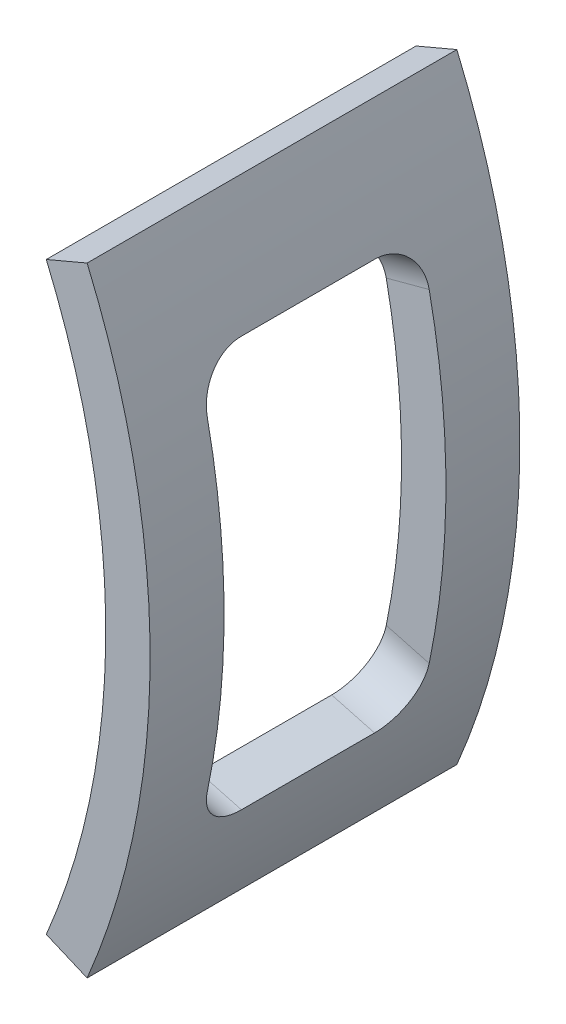
ISO-10303-21;
HEADER;
FILE_DESCRIPTION(('STEP AP214'),'2;1');
FILE_NAME('part.step','',(''),(''),'','','');
FILE_SCHEMA(('AUTOMOTIVE_DESIGN { 1 0 10303 214 1 1 1 1 }'));
ENDSEC;
DATA;
#1=APPLICATION_CONTEXT('core data for automotive mechanical design processes');
#2=APPLICATION_PROTOCOL_DEFINITION('international standard','automotive_design',2000,#1);
#3=PRODUCT_CONTEXT('',#1,'mechanical');
#4=PRODUCT('Part','Part','',(#3));
#5=PRODUCT_RELATED_PRODUCT_CATEGORY('part','',(#4));
#6=PRODUCT_DEFINITION_FORMATION('','',#4);
#7=PRODUCT_DEFINITION_CONTEXT('part definition',#1,'design');
#8=PRODUCT_DEFINITION('design','',#6,#7);
#9=PRODUCT_DEFINITION_SHAPE('','',#8);
#10=(LENGTH_UNIT() NAMED_UNIT(*) SI_UNIT(.MILLI.,.METRE.));
#11=(NAMED_UNIT(*) PLANE_ANGLE_UNIT() SI_UNIT($,.RADIAN.));
#12=(NAMED_UNIT(*) SI_UNIT($,.STERADIAN.) SOLID_ANGLE_UNIT());
#13=UNCERTAINTY_MEASURE_WITH_UNIT(LENGTH_MEASURE(1.E-05),#10,'distance_accuracy_value','');
#14=(GEOMETRIC_REPRESENTATION_CONTEXT(3) GLOBAL_UNCERTAINTY_ASSIGNED_CONTEXT((#13)) GLOBAL_UNIT_ASSIGNED_CONTEXT((#10,
#11,#12)) REPRESENTATION_CONTEXT('',''));
#15=CARTESIAN_POINT('',(0.,0.,0.));
#16=DIRECTION('',(0.,0.,1.));
#17=DIRECTION('',(1.,0.,0.));
#18=AXIS2_PLACEMENT_3D('',#15,#16,#17);
#19=CARTESIAN_POINT('',(0.,0.,17.7187500000009));
#20=DIRECTION('',(0.,0.,1.));
#21=DIRECTION('',(1.,0.,0.));
#22=AXIS2_PLACEMENT_3D('',#19,#20,#21);
#23=CYLINDRICAL_SURFACE('',#22,101.15);
#24=CARTESIAN_POINT('',(0.,0.,25.));
#25=DIRECTION('',(0.,0.,1.));
#26=DIRECTION('',(1.,0.,0.));
#27=AXIS2_PLACEMENT_3D('',#24,#25,#26);
#28=CIRCLE('',#27,101.15);
#29=CARTESIAN_POINT('',(93.1090659267143,-39.5224536466901,25.));
#30=VERTEX_POINT('',#29);
#31=CARTESIAN_POINT('',(93.1090659267143,39.5224536466901,25.));
#32=VERTEX_POINT('',#31);
#33=EDGE_CURVE('E126',#30,#32,#28,.T.);
#34=ORIENTED_EDGE('',*,*,#33,.T.);
#35=DIRECTION('',(0.,0.,1.));
#36=VECTOR('',#35,1.);
#37=CARTESIAN_POINT('',(93.1090659267143,39.5224536466901,25.));
#38=LINE('',#37,#36);
#39=CARTESIAN_POINT('',(93.1090659267143,39.5224536466901,-25.));
#40=VERTEX_POINT('',#39);
#41=EDGE_CURVE('E129',#40,#32,#38,.T.);
#42=ORIENTED_EDGE('',*,*,#41,.F.);
#43=CARTESIAN_POINT('',(0.,0.,-25.));
#44=DIRECTION('',(0.,0.,1.));
#45=DIRECTION('',(1.,0.,0.));
#46=AXIS2_PLACEMENT_3D('',#43,#44,#45);
#47=CIRCLE('',#46,101.15);
#48=CARTESIAN_POINT('',(93.1090659267143,-39.5224536466901,-25.));
#49=VERTEX_POINT('',#48);
#50=EDGE_CURVE('E166',#49,#40,#47,.T.);
#51=ORIENTED_EDGE('',*,*,#50,.F.);
#52=DIRECTION('',(0.,0.,1.));
#53=VECTOR('',#52,1.);
#54=CARTESIAN_POINT('',(93.1090659267143,-39.5224536466901,25.));
#55=LINE('',#54,#53);
#56=EDGE_CURVE('E132',#49,#30,#55,.T.);
#57=ORIENTED_EDGE('',*,*,#56,.T.);
#58=EDGE_LOOP('',(#34,#42,#51,#57));
#59=FACE_BOUND('',#58,.T.);
#60=CARTESIAN_POINT('',(0.,0.,15.));
#61=DIRECTION('',(0.,0.,1.));
#62=DIRECTION('',(1.,0.,0.));
#63=AXIS2_PLACEMENT_3D('',#60,#61,#62);
#64=CIRCLE('',#63,101.15);
#65=CARTESIAN_POINT('',(99.0842702151909,-20.3378931043271,15.));
#66=VERTEX_POINT('',#65);
#67=CARTESIAN_POINT('',(99.0842702151909,20.3378931043271,15.));
#68=VERTEX_POINT('',#67);
#69=EDGE_CURVE('E148',#66,#68,#64,.T.);
#70=ORIENTED_EDGE('',*,*,#69,.F.);
#71=CARTESIAN_POINT('',(99.0842702151909,-20.3378931043271,15.));
#72=CARTESIAN_POINT('',(99.0503488492395,-20.5031758536993,15.0000182217252));
#73=CARTESIAN_POINT('',(99.0160060727869,-20.6683704909268,14.9929085404795));
#74=CARTESIAN_POINT('',(98.9467488016159,-20.9974150237414,14.9645516831957));
#75=CARTESIAN_POINT('',(98.9118343277886,-21.1612649681397,14.9433050226371));
#76=CARTESIAN_POINT('',(98.8417278568613,-21.4863450901174,14.8868131347429));
#77=CARTESIAN_POINT('',(98.8065360810251,-21.6475770932883,14.8515781404965));
#78=CARTESIAN_POINT('',(98.736144584299,-21.9664036417796,14.767355785701));
#79=CARTESIAN_POINT('',(98.7009448635441,-22.123998244824,14.7183686435556));
#80=CARTESIAN_POINT('',(98.6308325335325,-22.4344984681379,14.6069598386645));
#81=CARTESIAN_POINT('',(98.5959200328227,-22.5874023703441,14.5445333190428));
#82=CARTESIAN_POINT('',(98.5267030508532,-22.8874419792117,14.4066690492712));
#83=CARTESIAN_POINT('',(98.4923987984401,-23.0345755390607,14.3312265119255));
#84=CARTESIAN_POINT('',(98.4247584850444,-23.3219037069828,14.1679241140697));
#85=CARTESIAN_POINT('',(98.3914218999316,-23.462102101554,14.0800711328075));
#86=CARTESIAN_POINT('',(98.3260158893124,-23.7347163255531,13.8925062050698));
#87=CARTESIAN_POINT('',(98.2939469083547,-23.8671294324796,13.7927901465206));
#88=CARTESIAN_POINT('',(98.2314508048502,-24.1230576236091,13.5823487362724));
#89=CARTESIAN_POINT('',(98.2010219040371,-24.2465823958109,13.4716356942576));
#90=CARTESIAN_POINT('',(98.1420865783467,-24.4840419740717,13.2398941043679));
#91=CARTESIAN_POINT('',(98.113580154033,-24.5979767773192,13.1188655534689));
#92=CARTESIAN_POINT('',(98.058785355846,-24.8155133876193,12.8673051397891));
#93=CARTESIAN_POINT('',(98.0324978180142,-24.9191113025489,12.7367697291771));
#94=CARTESIAN_POINT('',(97.9824495354845,-25.1151810778407,12.4672102710985));
#95=CARTESIAN_POINT('',(97.9586879198873,-25.2076567744274,12.3281891755607));
#96=CARTESIAN_POINT('',(97.9139246579101,-25.3809747742024,12.042468000183));
#97=CARTESIAN_POINT('',(97.8929256581692,-25.4618059286368,11.8957607422538));
#98=CARTESIAN_POINT('',(97.8539594650688,-25.6111513437929,11.5958888636078));
#99=CARTESIAN_POINT('',(97.8359911747117,-25.6796700617218,11.4427266045454));
#100=CARTESIAN_POINT('',(97.8032877901214,-25.8039440899407,11.1310184795286));
#101=CARTESIAN_POINT('',(97.7885517947013,-25.8597029579561,10.9724741284116));
#102=CARTESIAN_POINT('',(97.7624809114717,-25.9580894260837,10.6511556683923));
#103=CARTESIAN_POINT('',(97.7511452159942,-26.0007201445691,10.488382573934));
#104=CARTESIAN_POINT('',(97.728928551243,-26.0841234337606,10.1068451575689));
#105=CARTESIAN_POINT('',(97.7193615220593,-26.1199070857836,9.88687952484851));
#106=CARTESIAN_POINT('',(97.7097879079764,-26.1556872031681,9.55514280059046));
#107=CARTESIAN_POINT('',(97.7073928637877,-26.1646313419293,9.44432089966399));
#108=CARTESIAN_POINT('',(97.7041975677037,-26.1765601332365,9.22234187261277));
#109=CARTESIAN_POINT('',(97.7033972007916,-26.1795452155826,9.11118477124374));
#110=CARTESIAN_POINT('',(97.7033973291392,-26.17954641212,9.00000000000004));
#111=B_SPLINE_CURVE_WITH_KNOTS('',3,(#71,#72,#73,#74,#75,#76,#77,#78,#79,#80,#81,#82,#83,#84,
#85,#86,#87,#88,#89,#90,#91,#92,#93,#94,#95,#96,#97,#98,#99,#100,#101,#102,#103,#104,#105,#106,
#107,#108,#109,#110),.UNSPECIFIED.,.F.,.F.,(4,2,2,2,2,2,2,2,2,2,2,2,2,2,2,2,2,2,2,4),(0.,
0.506030729008249,1.01204300752844,1.51768579562712,2.0233205538529,2.52913835181936,
3.03514258400317,3.54086742503359,4.04676807797759,4.55210868989614,5.05744944996305,
5.56297977235144,6.06833522643753,6.57417134894587,7.0798239839231,7.5853354596326,
8.09072676672851,8.75834421135759,9.0918244158145,9.42528056696323),.UNSPECIFIED.);
#112=CARTESIAN_POINT('',(97.7033973291392,-26.17954641212,9.00000000000004));
#113=VERTEX_POINT('',#112);
#114=EDGE_CURVE('E217',#66,#113,#111,.T.);
#115=ORIENTED_EDGE('',*,*,#114,.T.);
#116=DIRECTION('',(0.,0.,1.));
#117=VECTOR('',#116,1.);
#118=CARTESIAN_POINT('',(97.7033973291392,-26.17954641212,15.));
#119=LINE('',#118,#117);
#120=CARTESIAN_POINT('',(97.7033973291392,-26.17954641212,-8.99999999999996));
#121=VERTEX_POINT('',#120);
#122=EDGE_CURVE('E276',#121,#113,#119,.T.);
#123=ORIENTED_EDGE('',*,*,#122,.F.);
#124=CARTESIAN_POINT('',(97.7033973291392,-26.17954641212,-8.99999999999996));
#125=CARTESIAN_POINT('',(97.7033895601714,-26.179563114756,-9.16875046089024));
#126=CARTESIAN_POINT('',(97.7052396147699,-26.172670522557,-9.3374983179577));
#127=CARTESIAN_POINT('',(97.7125992452598,-26.1451873781737,-9.673786789175));
#128=CARTESIAN_POINT('',(97.7181086461544,-26.12459748102,-9.84132746066742));
#129=CARTESIAN_POINT('',(97.73272537506,-26.0698608501464,-10.1738912487409));
#130=CARTESIAN_POINT('',(97.7418300040048,-26.0357242862985,-10.338916157689));
#131=CARTESIAN_POINT('',(97.7635278221914,-25.9541310824166,-10.6654029993976));
#132=CARTESIAN_POINT('',(97.7761209688387,-25.9066746050179,-10.8268649756353));
#133=CARTESIAN_POINT('',(97.8046540419408,-25.7987452867056,-11.1451294508987));
#134=CARTESIAN_POINT('',(97.8205949887383,-25.738268477313,-11.3019305127003));
#135=CARTESIAN_POINT('',(97.855643299667,-25.6046937405142,-11.609763768627));
#136=CARTESIAN_POINT('',(97.8747518280464,-25.5315911720809,-11.7607938164005));
#137=CARTESIAN_POINT('',(97.9159015534227,-25.3733206583454,-12.0558704863326));
#138=CARTESIAN_POINT('',(97.937941181334,-25.2881591668969,-12.1999207890098));
#139=CARTESIAN_POINT('',(97.984720534947,-25.1062911824136,-12.4801486811041));
#140=CARTESIAN_POINT('',(98.0094611962612,-25.0095806878173,-12.6163235173882));
#141=CARTESIAN_POINT('',(98.0613530281361,-24.8053348434355,-12.8797335163064));
#142=CARTESIAN_POINT('',(98.0885034004354,-24.6978030768281,-13.0069716145645));
#143=CARTESIAN_POINT('',(98.1449258990062,-24.4726273197551,-13.2516524009325));
#144=CARTESIAN_POINT('',(98.1741980241742,-24.3549833345482,-13.3690950941364));
#145=CARTESIAN_POINT('',(98.2345628144603,-24.1103513474988,-13.593389781772));
#146=CARTESIAN_POINT('',(98.2656561238266,-23.9833600348892,-13.700237991945));
#147=CARTESIAN_POINT('',(98.3293192121123,-23.7209969219757,-13.90250095528));
#148=CARTESIAN_POINT('',(98.3618884737456,-23.5856280518166,-13.9979196721401));
#149=CARTESIAN_POINT('',(98.4281821620848,-23.3074215306713,-14.1766832585618));
#150=CARTESIAN_POINT('',(98.4619065058701,-23.1645844154273,-14.260028992578));
#151=CARTESIAN_POINT('',(98.5301698766885,-22.8724858920125,-14.414036745076));
#152=CARTESIAN_POINT('',(98.5647086029673,-22.7232268391975,-14.4847033654964));
#153=CARTESIAN_POINT('',(98.6342797320511,-22.419314072732,-14.612876564007));
#154=CARTESIAN_POINT('',(98.6693120024614,-22.2646617900052,-14.6703866026251));
#155=CARTESIAN_POINT('',(98.7395486153922,-21.9510791802595,-14.771854501939));
#156=CARTESIAN_POINT('',(98.7747529150235,-21.7921498790577,-14.8158155813223));
#157=CARTESIAN_POINT('',(98.8562982064023,-21.4196579702241,-14.901751967831));
#158=CARTESIAN_POINT('',(98.9026021445271,-21.2048700210604,-14.9386011249172));
#159=CARTESIAN_POINT('',(98.9713580517938,-20.8807332464112,-14.9754405445462));
#160=CARTESIAN_POINT('',(98.9941486358303,-20.7724172928169,-14.9846479605663));
#161=CARTESIAN_POINT('',(99.0394410263247,-20.5553864901146,-14.9969268982933));
#162=CARTESIAN_POINT('',(99.0619428545109,-20.4466716718215,-14.9999988844013));
#163=CARTESIAN_POINT('',(99.0842702151909,-20.3378931043271,-15.));
#164=B_SPLINE_CURVE_WITH_KNOTS('',3,(#124,#125,#126,#127,#128,#129,#130,#131,#132,#133,#134,
#135,#136,#137,#138,#139,#140,#141,#142,#143,#144,#145,#146,#147,#148,#149,#150,#151,#152,#153,
#154,#155,#156,#157,#158,#159,#160,#161,#162,#163),.UNSPECIFIED.,.F.,.F.,(4,2,2,2,2,2,2,2,2,2,2,
2,2,2,2,2,2,2,2,4),(0.,0.506096873633892,1.01216954651409,1.51786301265747,2.02355030458321,
2.52939194416333,3.03541992032662,3.54117809022811,4.04711200920935,4.55287894936079,
5.0586456264963,5.56459231324857,6.07036302877287,6.57609751197279,7.08164806370763,
7.58706548903622,8.09236275480783,8.75917199928035,9.09223884516293,9.42528047969037),.UNSPECIFIED.);
#165=CARTESIAN_POINT('',(99.0842702151909,-20.3378931043271,-15.));
#166=VERTEX_POINT('',#165);
#167=EDGE_CURVE('E189',#121,#166,#164,.T.);
#168=ORIENTED_EDGE('',*,*,#167,.T.);
#169=CARTESIAN_POINT('',(0.,0.,-15.));
#170=DIRECTION('',(0.,0.,1.));
#171=DIRECTION('',(1.,0.,0.));
#172=AXIS2_PLACEMENT_3D('',#169,#170,#171);
#173=CIRCLE('',#172,101.15);
#174=CARTESIAN_POINT('',(99.0842702151909,20.3378931043271,-15.));
#175=VERTEX_POINT('',#174);
#176=EDGE_CURVE('E267',#166,#175,#173,.T.);
#177=ORIENTED_EDGE('',*,*,#176,.T.);
#178=CARTESIAN_POINT('',(99.0842702151909,20.3378931043271,-15.));
#179=CARTESIAN_POINT('',(99.0503488492395,20.5031758536993,-15.0000182217251));
#180=CARTESIAN_POINT('',(99.0160060727869,20.6683704909268,-14.9929085404794));
#181=CARTESIAN_POINT('',(98.9467488016159,20.9974150237414,-14.9645516831956));
#182=CARTESIAN_POINT('',(98.9118343277886,21.1612649681397,-14.943305022637));
#183=CARTESIAN_POINT('',(98.8417278568613,21.4863450901174,-14.8868131347428));
#184=CARTESIAN_POINT('',(98.8065360810251,21.6475770932883,-14.8515781404964));
#185=CARTESIAN_POINT('',(98.736144584299,21.9664036417796,-14.7673557857009));
#186=CARTESIAN_POINT('',(98.7009448635441,22.1239982448241,-14.7183686435556));
#187=CARTESIAN_POINT('',(98.6308325335325,22.4344984681379,-14.6069598386644));
#188=CARTESIAN_POINT('',(98.5959200328227,22.5874023703441,-14.5445333190427));
#189=CARTESIAN_POINT('',(98.5267030508532,22.8874419792117,-14.4066690492711));
#190=CARTESIAN_POINT('',(98.4923987984401,23.0345755390607,-14.3312265119254));
#191=CARTESIAN_POINT('',(98.4247584850444,23.3219037069828,-14.1679241140697));
#192=CARTESIAN_POINT('',(98.3914218999316,23.462102101554,-14.0800711328075));
#193=CARTESIAN_POINT('',(98.3260158893124,23.7347163255531,-13.8925062050697));
#194=CARTESIAN_POINT('',(98.2939469083547,23.8671294324796,-13.7927901465206));
#195=CARTESIAN_POINT('',(98.2314508048502,24.1230576236091,-13.5823487362723));
#196=CARTESIAN_POINT('',(98.2010219040371,24.2465823958109,-13.4716356942575));
#197=CARTESIAN_POINT('',(98.1420865783467,24.4840419740717,-13.2398941043679));
#198=CARTESIAN_POINT('',(98.113580154033,24.5979767773192,-13.1188655534688));
#199=CARTESIAN_POINT('',(98.058785355846,24.8155133876193,-12.867305139789));
#200=CARTESIAN_POINT('',(98.0324978180142,24.9191113025489,-12.736769729177));
#201=CARTESIAN_POINT('',(97.9824495354845,25.1151810778407,-12.4672102710984));
#202=CARTESIAN_POINT('',(97.9586879198873,25.2076567744274,-12.3281891755606));
#203=CARTESIAN_POINT('',(97.9139246579101,25.3809747742024,-12.0424680001829));
#204=CARTESIAN_POINT('',(97.8929256581692,25.4618059286368,-11.8957607422538));
#205=CARTESIAN_POINT('',(97.8539594650688,25.6111513437929,-11.5958888636077));
#206=CARTESIAN_POINT('',(97.8359911747117,25.6796700617218,-11.4427266045453));
#207=CARTESIAN_POINT('',(97.8032877901214,25.8039440899407,-11.1310184795285));
#208=CARTESIAN_POINT('',(97.7885517947013,25.8597029579561,-10.9724741284115));
#209=CARTESIAN_POINT('',(97.7624809114717,25.9580894260837,-10.6511556683922));
#210=CARTESIAN_POINT('',(97.7511452159942,26.0007201445691,-10.4883825739339));
#211=CARTESIAN_POINT('',(97.728928551243,26.0841234337606,-10.1068451575688));
#212=CARTESIAN_POINT('',(97.7193615220593,26.1199070857836,-9.88687952484843));
#213=CARTESIAN_POINT('',(97.7097879079764,26.1556872031681,-9.55514280059038));
#214=CARTESIAN_POINT('',(97.7073928637877,26.1646313419293,-9.44432089966391));
#215=CARTESIAN_POINT('',(97.7041975677037,26.1765601332365,-9.2223418726127));
#216=CARTESIAN_POINT('',(97.7033972007916,26.1795452155826,-9.11118477124367));
#217=CARTESIAN_POINT('',(97.7033973291392,26.17954641212,-8.99999999999996));
#218=B_SPLINE_CURVE_WITH_KNOTS('',3,(#178,#179,#180,#181,#182,#183,#184,#185,#186,#187,#188,
#189,#190,#191,#192,#193,#194,#195,#196,#197,#198,#199,#200,#201,#202,#203,#204,#205,#206,#207,
#208,#209,#210,#211,#212,#213,#214,#215,#216,#217),.UNSPECIFIED.,.F.,.F.,(4,2,2,2,2,2,2,2,2,2,2,
2,2,2,2,2,2,2,2,4),(0.,0.50603072900825,1.01204300752844,1.51768579562712,2.0233205538529,
2.52913835181936,3.03514258400317,3.54086742503359,4.04676807797759,4.55210868989614,
5.05744944996306,5.56297977235145,6.06833522643754,6.57417134894587,7.0798239839231,
7.58533545963261,8.09072676672852,8.75834421135759,9.09182441581451,9.42528056696323),.UNSPECIFIED.);
#219=CARTESIAN_POINT('',(97.7033973291392,26.17954641212,-8.99999999999996));
#220=VERTEX_POINT('',#219);
#221=EDGE_CURVE('E222',#175,#220,#218,.T.);
#222=ORIENTED_EDGE('',*,*,#221,.T.);
#223=DIRECTION('',(0.,0.,1.));
#224=VECTOR('',#223,1.);
#225=CARTESIAN_POINT('',(97.7033973291392,26.17954641212,15.));
#226=LINE('',#225,#224);
#227=CARTESIAN_POINT('',(97.7033973291392,26.17954641212,9.00000000000004));
#228=VERTEX_POINT('',#227);
#229=EDGE_CURVE('E271',#220,#228,#226,.T.);
#230=ORIENTED_EDGE('',*,*,#229,.T.);
#231=CARTESIAN_POINT('',(97.7033973291392,26.17954641212,9.00000000000004));
#232=CARTESIAN_POINT('',(97.7033895601714,26.179563114756,9.16875046089031));
#233=CARTESIAN_POINT('',(97.7052396147699,26.172670522557,9.33749831795778));
#234=CARTESIAN_POINT('',(97.7125992452598,26.1451873781737,9.67378678917507));
#235=CARTESIAN_POINT('',(97.7181086461545,26.12459748102,9.84132746066749));
#236=CARTESIAN_POINT('',(97.7327253750601,26.0698608501464,10.1738912487409));
#237=CARTESIAN_POINT('',(97.7418300040048,26.0357242862985,10.3389161576891));
#238=CARTESIAN_POINT('',(97.7635278221914,25.9541310824166,10.6654029993977));
#239=CARTESIAN_POINT('',(97.7761209688387,25.9066746050179,10.8268649756354));
#240=CARTESIAN_POINT('',(97.8046540419408,25.7987452867056,11.1451294508988));
#241=CARTESIAN_POINT('',(97.8205949887383,25.738268477313,11.3019305127004));
#242=CARTESIAN_POINT('',(97.855643299667,25.6046937405142,11.6097637686271));
#243=CARTESIAN_POINT('',(97.8747518280464,25.5315911720809,11.7607938164006));
#244=CARTESIAN_POINT('',(97.9159015534227,25.3733206583454,12.0558704863327));
#245=CARTESIAN_POINT('',(97.937941181334,25.2881591668969,12.1999207890099));
#246=CARTESIAN_POINT('',(97.984720534947,25.1062911824136,12.4801486811042));
#247=CARTESIAN_POINT('',(98.0094611962612,25.0095806878173,12.6163235173882));
#248=CARTESIAN_POINT('',(98.0613530281361,24.8053348434355,12.8797335163065));
#249=CARTESIAN_POINT('',(98.0885034004354,24.6978030768281,13.0069716145646));
#250=CARTESIAN_POINT('',(98.1449258990062,24.4726273197551,13.2516524009326));
#251=CARTESIAN_POINT('',(98.1741980241742,24.3549833345482,13.3690950941365));
#252=CARTESIAN_POINT('',(98.2345628144603,24.1103513474988,13.593389781772));
#253=CARTESIAN_POINT('',(98.2656561238267,23.9833600348892,13.7002379919451));
#254=CARTESIAN_POINT('',(98.3293192121123,23.7209969219757,13.9025009552801));
#255=CARTESIAN_POINT('',(98.3618884737456,23.5856280518166,13.9979196721402));
#256=CARTESIAN_POINT('',(98.4281821620848,23.3074215306713,14.1766832585619));
#257=CARTESIAN_POINT('',(98.4619065058701,23.1645844154273,14.2600289925781));
#258=CARTESIAN_POINT('',(98.5301698766886,22.8724858920125,14.4140367450761));
#259=CARTESIAN_POINT('',(98.5647086029673,22.7232268391975,14.4847033654965));
#260=CARTESIAN_POINT('',(98.6342797320511,22.419314072732,14.612876564007));
#261=CARTESIAN_POINT('',(98.6693120024614,22.2646617900052,14.6703866026252));
#262=CARTESIAN_POINT('',(98.7395486153922,21.9510791802595,14.7718545019391));
#263=CARTESIAN_POINT('',(98.7747529150236,21.7921498790577,14.8158155813224));
#264=CARTESIAN_POINT('',(98.8562982064023,21.4196579702241,14.9017519678311));
#265=CARTESIAN_POINT('',(98.9026021445271,21.2048700210604,14.9386011249172));
#266=CARTESIAN_POINT('',(98.9713580517938,20.8807332464112,14.9754405445463));
#267=CARTESIAN_POINT('',(98.9941486358303,20.7724172928169,14.9846479605664));
#268=CARTESIAN_POINT('',(99.0394410263247,20.5553864901146,14.9969268982934));
#269=CARTESIAN_POINT('',(99.0619428545109,20.4466716718215,14.9999988844014));
#270=CARTESIAN_POINT('',(99.0842702151909,20.3378931043271,15.));
#271=B_SPLINE_CURVE_WITH_KNOTS('',3,(#231,#232,#233,#234,#235,#236,#237,#238,#239,#240,#241,
#242,#243,#244,#245,#246,#247,#248,#249,#250,#251,#252,#253,#254,#255,#256,#257,#258,#259,#260,
#261,#262,#263,#264,#265,#266,#267,#268,#269,#270),.UNSPECIFIED.,.F.,.F.,(4,2,2,2,2,2,2,2,2,2,2,
2,2,2,2,2,2,2,2,4),(0.,0.506096873633892,1.01216954651409,1.51786301265747,2.02355030458321,
2.52939194416332,3.03541992032662,3.54117809022811,4.04711200920935,4.5528789493608,
5.05864562649631,5.56459231324858,6.07036302877288,6.5760975119728,7.08164806370764,
7.58706548903623,8.09236275480784,8.75917199928035,9.09223884516293,9.42528047969037),.UNSPECIFIED.);
#272=EDGE_CURVE('E11',#228,#68,#271,.T.);
#273=ORIENTED_EDGE('',*,*,#272,.T.);
#274=EDGE_LOOP('',(#70,#115,#123,#168,#177,#222,#230,#273));
#275=FACE_BOUND('',#274,.T.);
#276=ADVANCED_FACE('F33',(#59,#275),#23,.F.);
#277=CARTESIAN_POINT('',(0.,0.,17.7187500000009));
#278=DIRECTION('',(0.,0.,1.));
#279=DIRECTION('',(1.,0.,0.));
#280=AXIS2_PLACEMENT_3D('',#277,#278,#279);
#281=CYLINDRICAL_SURFACE('',#280,107.15);
#282=CARTESIAN_POINT('',(0.,0.,-25.));
#283=DIRECTION('',(0.,0.,1.));
#284=DIRECTION('',(1.,0.,0.));
#285=AXIS2_PLACEMENT_3D('',#282,#283,#284);
#286=CIRCLE('',#285,107.15);
#287=CARTESIAN_POINT('',(98.6320950474289,-41.8668404176258,-25.));
#288=VERTEX_POINT('',#287);
#289=CARTESIAN_POINT('',(98.6320950474289,41.8668404176258,-25.));
#290=VERTEX_POINT('',#289);
#291=EDGE_CURVE('E168',#288,#290,#286,.T.);
#292=ORIENTED_EDGE('',*,*,#291,.T.);
#293=DIRECTION('',(0.,0.,-1.));
#294=VECTOR('',#293,1.);
#295=CARTESIAN_POINT('',(98.6320950474289,41.8668404176258,25.));
#296=LINE('',#295,#294);
#297=CARTESIAN_POINT('',(98.6320950474289,41.8668404176258,25.));
#298=VERTEX_POINT('',#297);
#299=EDGE_CURVE('E151',#298,#290,#296,.T.);
#300=ORIENTED_EDGE('',*,*,#299,.F.);
#301=CARTESIAN_POINT('',(0.,0.,25.));
#302=DIRECTION('',(0.,0.,1.));
#303=DIRECTION('',(1.,0.,0.));
#304=AXIS2_PLACEMENT_3D('',#301,#302,#303);
#305=CIRCLE('',#304,107.15);
#306=CARTESIAN_POINT('',(98.6320950474289,-41.8668404176258,25.));
#307=VERTEX_POINT('',#306);
#308=EDGE_CURVE('E138',#307,#298,#305,.T.);
#309=ORIENTED_EDGE('',*,*,#308,.F.);
#310=DIRECTION('',(0.,0.,-1.));
#311=VECTOR('',#310,1.);
#312=CARTESIAN_POINT('',(98.6320950474289,-41.8668404176258,25.));
#313=LINE('',#312,#311);
#314=EDGE_CURVE('E160',#307,#288,#313,.T.);
#315=ORIENTED_EDGE('',*,*,#314,.T.);
#316=EDGE_LOOP('',(#292,#300,#309,#315));
#317=FACE_BOUND('',#316,.T.);
#318=CARTESIAN_POINT('',(0.,0.,-15.));
#319=DIRECTION('',(0.,0.,1.));
#320=DIRECTION('',(1.,0.,0.));
#321=AXIS2_PLACEMENT_3D('',#318,#319,#320);
#322=CIRCLE('',#321,107.15);
#323=CARTESIAN_POINT('',(104.889474437927,-21.8933928877069,-15.));
#324=VERTEX_POINT('',#323);
#325=CARTESIAN_POINT('',(104.889474437927,21.8933928877069,-15.));
#326=VERTEX_POINT('',#325);
#327=EDGE_CURVE('E257',#324,#326,#322,.T.);
#328=ORIENTED_EDGE('',*,*,#327,.F.);
#329=CARTESIAN_POINT('',(104.889474437927,-21.8933928877069,-15.));
#330=CARTESIAN_POINT('',(104.855002479608,-22.0585648590071,-15.0000182137029));
#331=CARTESIAN_POINT('',(104.82013301044,-22.22365213008,-14.9929055530653));
#332=CARTESIAN_POINT('',(104.749872443648,-22.5524889943068,-14.964538180414));
#333=CARTESIAN_POINT('',(104.714481365745,-22.7162386376712,-14.9432840017204));
#334=CARTESIAN_POINT('',(104.643474365405,-23.0411254961041,-14.8867739906038));
#335=CARTESIAN_POINT('',(104.607858626779,-23.2022645379716,-14.8515284320432));
#336=CARTESIAN_POINT('',(104.536671877529,-23.5209134375623,-14.7672830388519));
#337=CARTESIAN_POINT('',(104.501100866221,-23.6784233514323,-14.718283417167));
#338=CARTESIAN_POINT('',(104.430298069764,-23.9887617832138,-14.6068490838759));
#339=CARTESIAN_POINT('',(104.395066409743,-24.141588616491,-14.5444096009122));
#340=CARTESIAN_POINT('',(104.325261188575,-24.4414829955004,-14.4065193813338));
#341=CARTESIAN_POINT('',(104.290687874757,-24.5885483978714,-14.3310638578642));
#342=CARTESIAN_POINT('',(104.222556859952,-24.8757495441563,-14.1677358067531));
#343=CARTESIAN_POINT('',(104.188998610644,-25.0158890562208,-14.0798701337381));
#344=CARTESIAN_POINT('',(104.123192793141,-25.2883941864514,-13.8922805373558));
#345=CARTESIAN_POINT('',(104.090945684647,-25.4207570851575,-13.7925525021947));
#346=CARTESIAN_POINT('',(104.02812958397,-25.6766059519369,-13.5820774233368));
#347=CARTESIAN_POINT('',(103.997558935247,-25.8001007215228,-13.4713415725661));
#348=CARTESIAN_POINT('',(103.93837486166,-26.0375056662336,-13.2395532706604));
#349=CARTESIAN_POINT('',(103.909761437329,-26.1514158387427,-13.1185008167097));
#350=CARTESIAN_POINT('',(103.854782356941,-26.3689072941262,-12.8668918265981));
#351=CARTESIAN_POINT('',(103.828417546687,-26.4724846928454,-12.7363317481268));
#352=CARTESIAN_POINT('',(103.7782394039,-26.6685163308698,-12.4667224199963));
#353=CARTESIAN_POINT('',(103.754425191657,-26.7609744066179,-12.3276761233987));
#354=CARTESIAN_POINT('',(103.709577328443,-26.9342549750837,-12.0419104626401));
#355=CARTESIAN_POINT('',(103.688546221446,-27.015066828175,-11.8951842470482));
#356=CARTESIAN_POINT('',(103.649530548157,-27.1643750431081,-11.595275079888));
#357=CARTESIAN_POINT('',(103.631544879272,-27.2328758626861,-11.4420944903035));
#358=CARTESIAN_POINT('',(103.598817197574,-27.357114369006,-11.1303506825108));
#359=CARTESIAN_POINT('',(103.584074278312,-27.412855622617,-10.9717889828301));
#360=CARTESIAN_POINT('',(103.557996348639,-27.5112062845778,-10.6504369443283));
#361=CARTESIAN_POINT('',(103.546660527865,-27.5538188155961,-10.4876476210516));
#362=CARTESIAN_POINT('',(103.524456117079,-27.6371480268526,-10.1062133489252));
#363=CARTESIAN_POINT('',(103.514898952397,-27.6728902682508,-9.88637125964762));
#364=CARTESIAN_POINT('',(103.505335629367,-27.7086290179528,-9.5548232540336));
#365=CARTESIAN_POINT('',(103.502943264385,-27.7175628254832,-9.44406491636855));
#366=CARTESIAN_POINT('',(103.499751597834,-27.7294778510422,-9.22221357403327));
#367=CARTESIAN_POINT('',(103.498952181816,-27.7324594967183,-9.11112059398066));
#368=CARTESIAN_POINT('',(103.498952286874,-27.7324606827352,-8.99999999999996));
#369=B_SPLINE_CURVE_WITH_KNOTS('',3,(#329,#330,#331,#332,#333,#334,#335,#336,#337,#338,#339,
#340,#341,#342,#343,#344,#345,#346,#347,#348,#349,#350,#351,#352,#353,#354,#355,#356,#357,#358,
#359,#360,#361,#362,#363,#364,#365,#366,#367,#368),.UNSPECIFIED.,.F.,.F.,(4,2,2,2,2,2,2,2,2,2,2,
2,2,2,2,2,2,2,2,4),(0.,0.506039836383025,1.01206058953206,1.5177104572133,2.02335249665725,
2.52917434375126,3.03518261299021,3.54091247855246,4.04681815649895,4.55221458332827,
5.05761114810238,5.56319698438721,6.06860787746924,6.57447761036916,7.08016380082348,
7.58570845627877,8.09113277487715,8.75836639019175,9.09165414214253,9.42491794735142),.UNSPECIFIED.);
#370=CARTESIAN_POINT('',(103.498952286874,-27.7324606827352,-8.99999999999996));
#371=VERTEX_POINT('',#370);
#372=EDGE_CURVE('E195',#324,#371,#369,.T.);
#373=ORIENTED_EDGE('',*,*,#372,.T.);
#374=DIRECTION('',(0.,0.,-1.));
#375=VECTOR('',#374,1.);
#376=CARTESIAN_POINT('',(103.498952286874,-27.7324606827352,15.));
#377=LINE('',#376,#375);
#378=CARTESIAN_POINT('',(103.498952286874,-27.7324606827352,9.00000000000004));
#379=VERTEX_POINT('',#378);
#380=EDGE_CURVE('E281',#379,#371,#377,.T.);
#381=ORIENTED_EDGE('',*,*,#380,.F.);
#382=CARTESIAN_POINT('',(103.498952286874,-27.7324606827352,9.00000000000004));
#383=CARTESIAN_POINT('',(103.498944689861,-27.7324774317312,9.16875109997214));
#384=CARTESIAN_POINT('',(103.500794591859,-27.7255847425498,9.3374995960307));
#385=CARTESIAN_POINT('',(103.508154510752,-27.6981014527797,9.67378932891547));
#386=CARTESIAN_POINT('',(103.513664352564,-27.6775115074404,9.84133062310428));
#387=CARTESIAN_POINT('',(103.528283793581,-27.6227751818823,10.1738955197705));
#388=CARTESIAN_POINT('',(103.537390689973,-27.5886389801775,10.338920916209));
#389=CARTESIAN_POINT('',(103.559097271754,-27.5070475472355,10.6654087014351));
#390=CARTESIAN_POINT('',(103.571696914498,-27.4595924786171,10.8268711336993));
#391=CARTESIAN_POINT('',(103.60025036058,-27.3516678813587,11.1451364536167));
#392=CARTESIAN_POINT('',(103.61620518576,-27.291194387747,11.3019379050977));
#393=CARTESIAN_POINT('',(103.651292528599,-27.157629210476,11.6097719264582));
#394=CARTESIAN_POINT('',(103.670426214645,-27.0845328869194,11.7608023500052));
#395=CARTESIAN_POINT('',(103.711641970296,-26.9262789505492,12.0558797811626));
#396=CARTESIAN_POINT('',(103.733722462103,-26.8411277907401,12.1999304700348));
#397=CARTESIAN_POINT('',(103.780604148555,-26.6592857714626,12.4801592303015));
#398=CARTESIAN_POINT('',(103.805406286003,-26.5625909121194,12.616334548489));
#399=CARTESIAN_POINT('',(103.857447180112,-26.3583812096631,12.8797477974668));
#400=CARTESIAN_POINT('',(103.884685168983,-26.2508697746442,13.0069885220537));
#401=CARTESIAN_POINT('',(103.941313838111,-26.02574198155,13.2516745247864));
#402=CARTESIAN_POINT('',(103.970704517395,-25.9081256280409,13.3691198073586));
#403=CARTESIAN_POINT('',(104.031342462046,-25.6635570318604,13.5934198336874));
#404=CARTESIAN_POINT('',(104.062590387176,-25.5366014676975,13.7002707775354));
#405=CARTESIAN_POINT('',(104.126603314154,-25.2743188742587,13.902539153693));
#406=CARTESIAN_POINT('',(104.15936778472,-25.1389947711742,13.9979605486304));
#407=CARTESIAN_POINT('',(104.226098919925,-24.8608778915386,14.1767353548146));
#408=CARTESIAN_POINT('',(104.260065579899,-24.7180851439568,14.2600888128658));
#409=CARTESIAN_POINT('',(104.328861764362,-24.4260842902149,14.4141097598332));
#410=CARTESIAN_POINT('',(104.363690970557,-24.2768785360304,14.484781851265));
#411=CARTESIAN_POINT('',(104.433893598845,-23.9730818610813,14.6129629850137));
#412=CARTESIAN_POINT('',(104.469266873837,-23.8184923821046,14.6704755207621));
#413=CARTESIAN_POINT('',(104.540237357405,-23.5050444785217,14.771944810315));
#414=CARTESIAN_POINT('',(104.575834510666,-23.3461870789256,14.8159047878991));
#415=CARTESIAN_POINT('',(104.658327118875,-22.9739845618462,14.9018074305662));
#416=CARTESIAN_POINT('',(104.705205020529,-22.7594205153728,14.9386349804929));
#417=CARTESIAN_POINT('',(104.774888014302,-22.4356316214572,14.9754536062257));
#418=CARTESIAN_POINT('',(104.797998482894,-22.3274335160231,14.9846560266949));
#419=CARTESIAN_POINT('',(104.843952113126,-22.1106419406784,14.996928437449));
#420=CARTESIAN_POINT('',(104.866795294691,-22.0020485010393,14.9999988877715));
#421=CARTESIAN_POINT('',(104.889474437927,-21.8933928877069,15.));
#422=B_SPLINE_CURVE_WITH_KNOTS('',3,(#382,#383,#384,#385,#386,#387,#388,#389,#390,#391,#392,
#393,#394,#395,#396,#397,#398,#399,#400,#401,#402,#403,#404,#405,#406,#407,#408,#409,#410,#411,
#412,#413,#414,#415,#416,#417,#418,#419,#420,#421),.UNSPECIFIED.,.F.,.F.,(4,2,2,2,2,2,2,2,2,2,2,
2,2,2,2,2,2,2,2,4),(0.,0.506098789026901,1.01217336903637,1.51786840778819,2.02355727244937,
2.52940037127593,3.03542980513655,3.54118937643204,4.04712470409316,4.55290111757548,
5.05867730250593,5.56463424466085,6.07041526053115,6.57619431471863,7.08178943090887,
7.5872501720137,8.09259058502308,8.7591040147883,9.09202343004855,9.42491786781305),.UNSPECIFIED.);
#423=CARTESIAN_POINT('',(104.889474437927,-21.8933928877069,15.));
#424=VERTEX_POINT('',#423);
#425=EDGE_CURVE('E241',#379,#424,#422,.T.);
#426=ORIENTED_EDGE('',*,*,#425,.T.);
#427=CARTESIAN_POINT('',(0.,0.,15.));
#428=DIRECTION('',(0.,0.,1.));
#429=DIRECTION('',(1.,0.,0.));
#430=AXIS2_PLACEMENT_3D('',#427,#428,#429);
#431=CIRCLE('',#430,107.15);
#432=CARTESIAN_POINT('',(104.889474437927,21.8933928877069,15.));
#433=VERTEX_POINT('',#432);
#434=EDGE_CURVE('E266',#424,#433,#431,.T.);
#435=ORIENTED_EDGE('',*,*,#434,.T.);
#436=CARTESIAN_POINT('',(104.889474437927,21.8933928877069,15.));
#437=CARTESIAN_POINT('',(104.855002479608,22.0585648590071,15.000018213703));
#438=CARTESIAN_POINT('',(104.82013301044,22.22365213008,14.9929055530653));
#439=CARTESIAN_POINT('',(104.749872443648,22.5524889943068,14.964538180414));
#440=CARTESIAN_POINT('',(104.714481365745,22.7162386376712,14.9432840017204));
#441=CARTESIAN_POINT('',(104.643474365405,23.0411254961041,14.8867739906038));
#442=CARTESIAN_POINT('',(104.607858626779,23.2022645379716,14.8515284320433));
#443=CARTESIAN_POINT('',(104.536671877529,23.5209134375623,14.767283038852));
#444=CARTESIAN_POINT('',(104.501100866221,23.6784233514323,14.7182834171671));
#445=CARTESIAN_POINT('',(104.430298069764,23.9887617832138,14.606849083876));
#446=CARTESIAN_POINT('',(104.395066409743,24.141588616491,14.5444096009123));
#447=CARTESIAN_POINT('',(104.325261188575,24.4414829955004,14.4065193813339));
#448=CARTESIAN_POINT('',(104.290687874757,24.5885483978714,14.3310638578643));
#449=CARTESIAN_POINT('',(104.222556859952,24.8757495441563,14.1677358067532));
#450=CARTESIAN_POINT('',(104.188998610644,25.0158890562208,14.0798701337382));
#451=CARTESIAN_POINT('',(104.123192793141,25.2883941864514,13.8922805373559));
#452=CARTESIAN_POINT('',(104.090945684647,25.4207570851575,13.7925525021948));
#453=CARTESIAN_POINT('',(104.02812958397,25.6766059519369,13.5820774233369));
#454=CARTESIAN_POINT('',(103.997558935247,25.8001007215228,13.4713415725661));
#455=CARTESIAN_POINT('',(103.93837486166,26.0375056662336,13.2395532706605));
#456=CARTESIAN_POINT('',(103.909761437329,26.1514158387427,13.1185008167098));
#457=CARTESIAN_POINT('',(103.854782356941,26.3689072941262,12.8668918265982));
#458=CARTESIAN_POINT('',(103.828417546687,26.4724846928454,12.7363317481269));
#459=CARTESIAN_POINT('',(103.7782394039,26.6685163308698,12.4667224199964));
#460=CARTESIAN_POINT('',(103.754425191657,26.7609744066179,12.3276761233988));
#461=CARTESIAN_POINT('',(103.709577328443,26.9342549750837,12.0419104626402));
#462=CARTESIAN_POINT('',(103.688546221446,27.015066828175,11.8951842470483));
#463=CARTESIAN_POINT('',(103.649530548157,27.1643750431081,11.595275079888));
#464=CARTESIAN_POINT('',(103.631544879272,27.2328758626861,11.4420944903036));
#465=CARTESIAN_POINT('',(103.598817197574,27.357114369006,11.1303506825109));
#466=CARTESIAN_POINT('',(103.584074278312,27.412855622617,10.9717889828302));
#467=CARTESIAN_POINT('',(103.557996348639,27.5112062845778,10.6504369443284));
#468=CARTESIAN_POINT('',(103.546660527865,27.5538188155961,10.4876476210517));
#469=CARTESIAN_POINT('',(103.524456117079,27.6371480268526,10.1062133489252));
#470=CARTESIAN_POINT('',(103.514898952397,27.6728902682508,9.88637125964769));
#471=CARTESIAN_POINT('',(103.505335629367,27.7086290179527,9.55482325403368));
#472=CARTESIAN_POINT('',(103.502943264385,27.7175628254832,9.44406491636863));
#473=CARTESIAN_POINT('',(103.499751597834,27.7294778510422,9.22221357403335));
#474=CARTESIAN_POINT('',(103.498952181816,27.7324594967183,9.11112059398073));
#475=CARTESIAN_POINT('',(103.498952286874,27.7324606827352,9.00000000000003));
#476=B_SPLINE_CURVE_WITH_KNOTS('',3,(#436,#437,#438,#439,#440,#441,#442,#443,#444,#445,#446,
#447,#448,#449,#450,#451,#452,#453,#454,#455,#456,#457,#458,#459,#460,#461,#462,#463,#464,#465,
#466,#467,#468,#469,#470,#471,#472,#473,#474,#475),.UNSPECIFIED.,.F.,.F.,(4,2,2,2,2,2,2,2,2,2,2,
2,2,2,2,2,2,2,2,4),(0.,0.50603983638303,1.01206058953207,1.51771045721331,2.02335249665726,
2.52917434375126,3.03518261299021,3.54091247855247,4.04681815649897,4.55221458332828,
5.05761114810239,5.56319698438722,6.06860787746925,6.57447761036917,7.08016380082348,
7.58570845627878,8.09113277487716,8.75836639019175,9.09165414214253,9.42491794735142),.UNSPECIFIED.);
#477=CARTESIAN_POINT('',(103.498952286874,27.7324606827352,9.00000000000004));
#478=VERTEX_POINT('',#477);
#479=EDGE_CURVE('E46',#433,#478,#476,.T.);
#480=ORIENTED_EDGE('',*,*,#479,.T.);
#481=DIRECTION('',(0.,0.,-1.));
#482=VECTOR('',#481,1.);
#483=CARTESIAN_POINT('',(103.498952286874,27.7324606827352,15.));
#484=LINE('',#483,#482);
#485=CARTESIAN_POINT('',(103.498952286874,27.7324606827352,-8.99999999999996));
#486=VERTEX_POINT('',#485);
#487=EDGE_CURVE('E259',#478,#486,#484,.T.);
#488=ORIENTED_EDGE('',*,*,#487,.T.);
#489=CARTESIAN_POINT('',(103.498952286874,27.7324606827352,-8.99999999999996));
#490=CARTESIAN_POINT('',(103.498944689861,27.7324774317312,-9.16875109997206));
#491=CARTESIAN_POINT('',(103.500794591859,27.7255847425498,-9.33749959603062));
#492=CARTESIAN_POINT('',(103.508154510752,27.6981014527797,-9.67378932891539));
#493=CARTESIAN_POINT('',(103.513664352564,27.6775115074404,-9.84133062310421));
#494=CARTESIAN_POINT('',(103.528283793581,27.6227751818823,-10.1738955197705));
#495=CARTESIAN_POINT('',(103.537390689973,27.5886389801775,-10.338920916209));
#496=CARTESIAN_POINT('',(103.559097271754,27.5070475472355,-10.665408701435));
#497=CARTESIAN_POINT('',(103.571696914498,27.4595924786171,-10.8268711336992));
#498=CARTESIAN_POINT('',(103.60025036058,27.3516678813587,-11.1451364536167));
#499=CARTESIAN_POINT('',(103.61620518576,27.291194387747,-11.3019379050977));
#500=CARTESIAN_POINT('',(103.651292528599,27.157629210476,-11.6097719264582));
#501=CARTESIAN_POINT('',(103.670426214645,27.0845328869194,-11.7608023500051));
#502=CARTESIAN_POINT('',(103.711641970296,26.9262789505492,-12.0558797811625));
#503=CARTESIAN_POINT('',(103.733722462103,26.8411277907401,-12.1999304700347));
#504=CARTESIAN_POINT('',(103.780604148555,26.6592857714626,-12.4801592303014));
#505=CARTESIAN_POINT('',(103.805406286003,26.5625909121194,-12.6163345484889));
#506=CARTESIAN_POINT('',(103.857447180112,26.3583812096631,-12.8797477974667));
#507=CARTESIAN_POINT('',(103.884685168983,26.2508697746442,-13.0069885220536));
#508=CARTESIAN_POINT('',(103.941313838111,26.02574198155,-13.2516745247863));
#509=CARTESIAN_POINT('',(103.970704517395,25.9081256280408,-13.3691198073585));
#510=CARTESIAN_POINT('',(104.031342462046,25.6635570318604,-13.5934198336874));
#511=CARTESIAN_POINT('',(104.062590387176,25.5366014676975,-13.7002707775353));
#512=CARTESIAN_POINT('',(104.126603314154,25.2743188742587,-13.902539153693));
#513=CARTESIAN_POINT('',(104.15936778472,25.1389947711742,-13.9979605486304));
#514=CARTESIAN_POINT('',(104.226098919925,24.8608778915386,-14.1767353548145));
#515=CARTESIAN_POINT('',(104.260065579899,24.7180851439568,-14.2600888128657));
#516=CARTESIAN_POINT('',(104.328861764362,24.4260842902149,-14.4141097598331));
#517=CARTESIAN_POINT('',(104.363690970557,24.2768785360304,-14.4847818512649));
#518=CARTESIAN_POINT('',(104.433893598845,23.9730818610813,-14.6129629850136));
#519=CARTESIAN_POINT('',(104.469266873837,23.8184923821046,-14.670475520762));
#520=CARTESIAN_POINT('',(104.540237357405,23.5050444785217,-14.771944810315));
#521=CARTESIAN_POINT('',(104.575834510666,23.3461870789256,-14.8159047878991));
#522=CARTESIAN_POINT('',(104.658327118875,22.9739845618462,-14.9018074305661));
#523=CARTESIAN_POINT('',(104.705205020529,22.7594205153728,-14.9386349804929));
#524=CARTESIAN_POINT('',(104.774888014302,22.4356316214572,-14.9754536062256));
#525=CARTESIAN_POINT('',(104.797998482894,22.3274335160231,-14.9846560266949));
#526=CARTESIAN_POINT('',(104.843952113126,22.1106419406784,-14.9969284374489));
#527=CARTESIAN_POINT('',(104.866795294691,22.0020485010393,-14.9999988877714));
#528=CARTESIAN_POINT('',(104.889474437927,21.8933928877069,-15.));
#529=B_SPLINE_CURVE_WITH_KNOTS('',3,(#489,#490,#491,#492,#493,#494,#495,#496,#497,#498,#499,
#500,#501,#502,#503,#504,#505,#506,#507,#508,#509,#510,#511,#512,#513,#514,#515,#516,#517,#518,
#519,#520,#521,#522,#523,#524,#525,#526,#527,#528),.UNSPECIFIED.,.F.,.F.,(4,2,2,2,2,2,2,2,2,2,2,
2,2,2,2,2,2,2,2,4),(0.,0.506098789026902,1.01217336903637,1.51786840778819,2.02355727244937,
2.52940037127593,3.03542980513655,3.54118937643204,4.04712470409317,4.55290111757548,
5.05867730250593,5.56463424466085,6.07041526053115,6.57619431471863,7.08178943090887,
7.5872501720137,8.09259058502308,8.7591040147883,9.09202343004854,9.42491786781305),.UNSPECIFIED.);
#530=EDGE_CURVE('E227',#486,#326,#529,.T.);
#531=ORIENTED_EDGE('',*,*,#530,.T.);
#532=EDGE_LOOP('',(#328,#373,#381,#426,#435,#480,#488,#531));
#533=FACE_BOUND('',#532,.T.);
#534=ADVANCED_FACE('F209',(#317,#533),#281,.T.);
#535=CARTESIAN_POINT('',(98.6320950474289,-41.8668404176258,25.));
#536=DIRECTION('',(0.,0.,1.));
#537=DIRECTION('',(1.,0.,0.));
#538=AXIS2_PLACEMENT_3D('',#535,#536,#537);
#539=PLANE('',#538);
#540=ORIENTED_EDGE('',*,*,#308,.T.);
#541=DIRECTION('',(0.92050485345244,0.390731128489275,0.));
#542=VECTOR('',#541,1.);
#543=CARTESIAN_POINT('',(98.6320950474289,41.8668404176258,25.));
#544=LINE('',#543,#542);
#545=EDGE_CURVE('E144',#32,#298,#544,.T.);
#546=ORIENTED_EDGE('',*,*,#545,.F.);
#547=ORIENTED_EDGE('',*,*,#33,.F.);
#548=DIRECTION('',(0.92050485345244,-0.390731128489274,0.));
#549=VECTOR('',#548,1.);
#550=CARTESIAN_POINT('',(98.6320950474289,-41.8668404176258,25.));
#551=LINE('',#550,#549);
#552=EDGE_CURVE('E158',#30,#307,#551,.T.);
#553=ORIENTED_EDGE('',*,*,#552,.T.);
#554=EDGE_LOOP('',(#540,#546,#547,#553));
#555=FACE_BOUND('',#554,.T.);
#556=ADVANCED_FACE('F150',(#555),#539,.T.);
#557=CARTESIAN_POINT('',(98.6320950474289,-41.8668404176258,-25.));
#558=DIRECTION('',(0.,0.,-1.));
#559=DIRECTION('',(-1.,0.,0.));
#560=AXIS2_PLACEMENT_3D('',#557,#558,#559);
#561=PLANE('',#560);
#562=DIRECTION('',(-0.92050485345244,0.390731128489274,0.));
#563=VECTOR('',#562,1.);
#564=CARTESIAN_POINT('',(98.6320950474289,-41.8668404176258,-25.));
#565=LINE('',#564,#563);
#566=EDGE_CURVE('E163',#288,#49,#565,.T.);
#567=ORIENTED_EDGE('',*,*,#566,.T.);
#568=ORIENTED_EDGE('',*,*,#50,.T.);
#569=DIRECTION('',(-0.92050485345244,-0.390731128489275,0.));
#570=VECTOR('',#569,1.);
#571=CARTESIAN_POINT('',(98.6320950474289,41.8668404176258,-25.));
#572=LINE('',#571,#570);
#573=EDGE_CURVE('E147',#290,#40,#572,.T.);
#574=ORIENTED_EDGE('',*,*,#573,.F.);
#575=ORIENTED_EDGE('',*,*,#291,.F.);
#576=EDGE_LOOP('',(#567,#568,#574,#575));
#577=FACE_BOUND('',#576,.T.);
#578=ADVANCED_FACE('F212',(#577),#561,.T.);
#579=CARTESIAN_POINT('',(0.,0.,0.));
#580=DIRECTION('',(0.390731128489274,0.92050485345244,0.));
#581=DIRECTION('',(0.,0.,1.));
#582=AXIS2_PLACEMENT_3D('',#579,#580,#581);
#583=PLANE('',#582);
#584=ORIENTED_EDGE('',*,*,#56,.F.);
#585=ORIENTED_EDGE('',*,*,#566,.F.);
#586=ORIENTED_EDGE('',*,*,#314,.F.);
#587=ORIENTED_EDGE('',*,*,#552,.F.);
#588=EDGE_LOOP('',(#584,#585,#586,#587));
#589=FACE_BOUND('',#588,.T.);
#590=ADVANCED_FACE('F210',(#589),#583,.F.);
#591=CARTESIAN_POINT('',(0.,0.,0.));
#592=DIRECTION('',(-0.390731128489275,0.92050485345244,0.));
#593=DIRECTION('',(0.,0.,1.));
#594=AXIS2_PLACEMENT_3D('',#591,#592,#593);
#595=PLANE('',#594);
#596=ORIENTED_EDGE('',*,*,#41,.T.);
#597=ORIENTED_EDGE('',*,*,#545,.T.);
#598=ORIENTED_EDGE('',*,*,#299,.T.);
#599=ORIENTED_EDGE('',*,*,#573,.T.);
#600=EDGE_LOOP('',(#596,#597,#598,#599));
#601=FACE_BOUND('',#600,.T.);
#602=ADVANCED_FACE('F142',(#601),#595,.T.);
#603=CARTESIAN_POINT('',(103.498952286874,-27.7324606827352,15.));
#604=DIRECTION('',(0.,0.,1.));
#605=DIRECTION('',(1.,0.,0.));
#606=AXIS2_PLACEMENT_3D('',#603,#604,#605);
#607=PLANE('',#606);
#608=ORIENTED_EDGE('',*,*,#434,.F.);
#609=DIRECTION('',(0.965925826289068,-0.258819045102521,0.));
#610=VECTOR('',#609,1.);
#611=CARTESIAN_POINT('',(105.051866557489,-21.9369057250007,15.));
#612=LINE('',#611,#610);
#613=EDGE_CURVE('E184',#424,#66,#612,.F.);
#614=ORIENTED_EDGE('',*,*,#613,.T.);
#615=ORIENTED_EDGE('',*,*,#69,.T.);
#616=DIRECTION('',(0.965925826289068,0.258819045102521,0.));
#617=VECTOR('',#616,1.);
#618=CARTESIAN_POINT('',(105.051866557489,21.9369057250007,15.));
#619=LINE('',#618,#617);
#620=EDGE_CURVE('E181',#68,#433,#619,.T.);
#621=ORIENTED_EDGE('',*,*,#620,.T.);
#622=EDGE_LOOP('',(#608,#614,#615,#621));
#623=FACE_BOUND('',#622,.T.);
#624=ADVANCED_FACE('F289',(#623),#607,.F.);
#625=CARTESIAN_POINT('',(103.498952286874,-27.7324606827352,-15.));
#626=DIRECTION('',(0.,0.,-1.));
#627=DIRECTION('',(-1.,0.,0.));
#628=AXIS2_PLACEMENT_3D('',#625,#626,#627);
#629=PLANE('',#628);
#630=ORIENTED_EDGE('',*,*,#176,.F.);
#631=DIRECTION('',(-0.965925826289068,0.258819045102521,0.));
#632=VECTOR('',#631,1.);
#633=CARTESIAN_POINT('',(105.051866557489,-21.9369057250007,-15.));
#634=LINE('',#633,#632);
#635=EDGE_CURVE('E179',#166,#324,#634,.F.);
#636=ORIENTED_EDGE('',*,*,#635,.T.);
#637=ORIENTED_EDGE('',*,*,#327,.T.);
#638=DIRECTION('',(-0.965925826289068,-0.258819045102521,0.));
#639=VECTOR('',#638,1.);
#640=CARTESIAN_POINT('',(99.2563115997544,20.3839914543856,-15.));
#641=LINE('',#640,#639);
#642=EDGE_CURVE('E176',#326,#175,#641,.T.);
#643=ORIENTED_EDGE('',*,*,#642,.T.);
#644=EDGE_LOOP('',(#630,#636,#637,#643));
#645=FACE_BOUND('',#644,.T.);
#646=ADVANCED_FACE('F263',(#645),#629,.F.);
#647=CARTESIAN_POINT('',(0.,0.,0.));
#648=DIRECTION('',(0.258819045102521,0.965925826289068,0.));
#649=DIRECTION('',(0.,0.,1.));
#650=AXIS2_PLACEMENT_3D('',#647,#648,#649);
#651=PLANE('',#650);
#652=ORIENTED_EDGE('',*,*,#380,.T.);
#653=DIRECTION('',(-0.965925826289068,0.258819045102521,0.));
#654=VECTOR('',#653,1.);
#655=CARTESIAN_POINT('',(0.,0.,-8.99999999999996));
#656=LINE('',#655,#654);
#657=EDGE_CURVE('E173',#371,#121,#656,.T.);
#658=ORIENTED_EDGE('',*,*,#657,.T.);
#659=ORIENTED_EDGE('',*,*,#122,.T.);
#660=DIRECTION('',(0.965925826289068,-0.258819045102521,0.));
#661=VECTOR('',#660,1.);
#662=CARTESIAN_POINT('',(0.,0.,9.00000000000004));
#663=LINE('',#662,#661);
#664=EDGE_CURVE('E137',#113,#379,#663,.T.);
#665=ORIENTED_EDGE('',*,*,#664,.T.);
#666=EDGE_LOOP('',(#652,#658,#659,#665));
#667=FACE_BOUND('',#666,.T.);
#668=ADVANCED_FACE('F316',(#667),#651,.T.);
#669=CARTESIAN_POINT('',(0.,0.,0.));
#670=DIRECTION('',(-0.258819045102521,0.965925826289068,0.));
#671=DIRECTION('',(0.,0.,1.));
#672=AXIS2_PLACEMENT_3D('',#669,#670,#671);
#673=PLANE('',#672);
#674=ORIENTED_EDGE('',*,*,#229,.F.);
#675=DIRECTION('',(-0.965925826289068,-0.258819045102521,0.));
#676=VECTOR('',#675,1.);
#677=CARTESIAN_POINT('',(103.498952286874,27.7324606827352,-8.99999999999996));
#678=LINE('',#677,#676);
#679=EDGE_CURVE('E53',#220,#486,#678,.F.);
#680=ORIENTED_EDGE('',*,*,#679,.T.);
#681=ORIENTED_EDGE('',*,*,#487,.F.);
#682=DIRECTION('',(0.965925826289068,0.258819045102521,0.));
#683=VECTOR('',#682,1.);
#684=CARTESIAN_POINT('',(97.7033973291392,26.17954641212,9.00000000000004));
#685=LINE('',#684,#683);
#686=EDGE_CURVE('E186',#478,#228,#685,.F.);
#687=ORIENTED_EDGE('',*,*,#686,.T.);
#688=EDGE_LOOP('',(#674,#680,#681,#687));
#689=FACE_BOUND('',#688,.T.);
#690=ADVANCED_FACE('F273',(#689),#673,.F.);
#691=CARTESIAN_POINT('',(1.55291427061513,5.79555495773441,-8.99999999999996));
#692=DIRECTION('',(-0.965925826289068,0.258819045102521,0.));
#693=DIRECTION('',(-0.258819045102521,-0.965925826289068,0.));
#694=AXIS2_PLACEMENT_3D('',#691,#692,#693);
#695=CYLINDRICAL_SURFACE('',#694,6.);
#696=ORIENTED_EDGE('',*,*,#372,.F.);
#697=ORIENTED_EDGE('',*,*,#635,.F.);
#698=ORIENTED_EDGE('',*,*,#167,.F.);
#699=ORIENTED_EDGE('',*,*,#657,.F.);
#700=EDGE_LOOP('',(#696,#697,#698,#699));
#701=FACE_BOUND('',#700,.T.);
#702=ADVANCED_FACE('F201',(#701),#695,.F.);
#703=CARTESIAN_POINT('',(1.55291427061513,5.79555495773441,9.00000000000004));
#704=DIRECTION('',(0.965925826289068,-0.258819045102521,0.));
#705=DIRECTION('',(0.258819045102521,0.965925826289068,0.));
#706=AXIS2_PLACEMENT_3D('',#703,#704,#705);
#707=CYLINDRICAL_SURFACE('',#706,6.);
#708=ORIENTED_EDGE('',*,*,#114,.F.);
#709=ORIENTED_EDGE('',*,*,#613,.F.);
#710=ORIENTED_EDGE('',*,*,#425,.F.);
#711=ORIENTED_EDGE('',*,*,#664,.F.);
#712=EDGE_LOOP('',(#708,#709,#710,#711));
#713=FACE_BOUND('',#712,.T.);
#714=ADVANCED_FACE('F234',(#713),#707,.F.);
#715=CARTESIAN_POINT('',(91.1856362161212,18.2214605029674,-8.99999999999996));
#716=DIRECTION('',(0.965925826289068,0.258819045102521,0.));
#717=DIRECTION('',(-0.258819045102521,0.965925826289068,0.));
#718=AXIS2_PLACEMENT_3D('',#715,#716,#717);
#719=CYLINDRICAL_SURFACE('',#718,6.);
#720=ORIENTED_EDGE('',*,*,#530,.F.);
#721=ORIENTED_EDGE('',*,*,#679,.F.);
#722=ORIENTED_EDGE('',*,*,#221,.F.);
#723=ORIENTED_EDGE('',*,*,#642,.F.);
#724=EDGE_LOOP('',(#720,#721,#722,#723));
#725=FACE_BOUND('',#724,.T.);
#726=ADVANCED_FACE('F231',(#725),#719,.F.);
#727=CARTESIAN_POINT('',(91.1856362161212,18.2214605029674,9.00000000000004));
#728=DIRECTION('',(-0.965925826289068,-0.258819045102521,0.));
#729=DIRECTION('',(0.258819045102521,-0.965925826289068,0.));
#730=AXIS2_PLACEMENT_3D('',#727,#728,#729);
#731=CYLINDRICAL_SURFACE('',#730,6.);
#732=ORIENTED_EDGE('',*,*,#272,.F.);
#733=ORIENTED_EDGE('',*,*,#686,.F.);
#734=ORIENTED_EDGE('',*,*,#479,.F.);
#735=ORIENTED_EDGE('',*,*,#620,.F.);
#736=EDGE_LOOP('',(#732,#733,#734,#735));
#737=FACE_BOUND('',#736,.T.);
#738=ADVANCED_FACE('F35',(#737),#731,.F.);
#739=CLOSED_SHELL('',(#276,#534,#556,#578,#590,#602,#624,#646,#668,#690,#702,#714,#726,#738));
#740=MANIFOLD_SOLID_BREP('B2',#739);
#741=ADVANCED_BREP_SHAPE_REPRESENTATION('',(#18,#740),#14);
#742=SHAPE_DEFINITION_REPRESENTATION(#9,#741);
ENDSEC;
END-ISO-10303-21;
